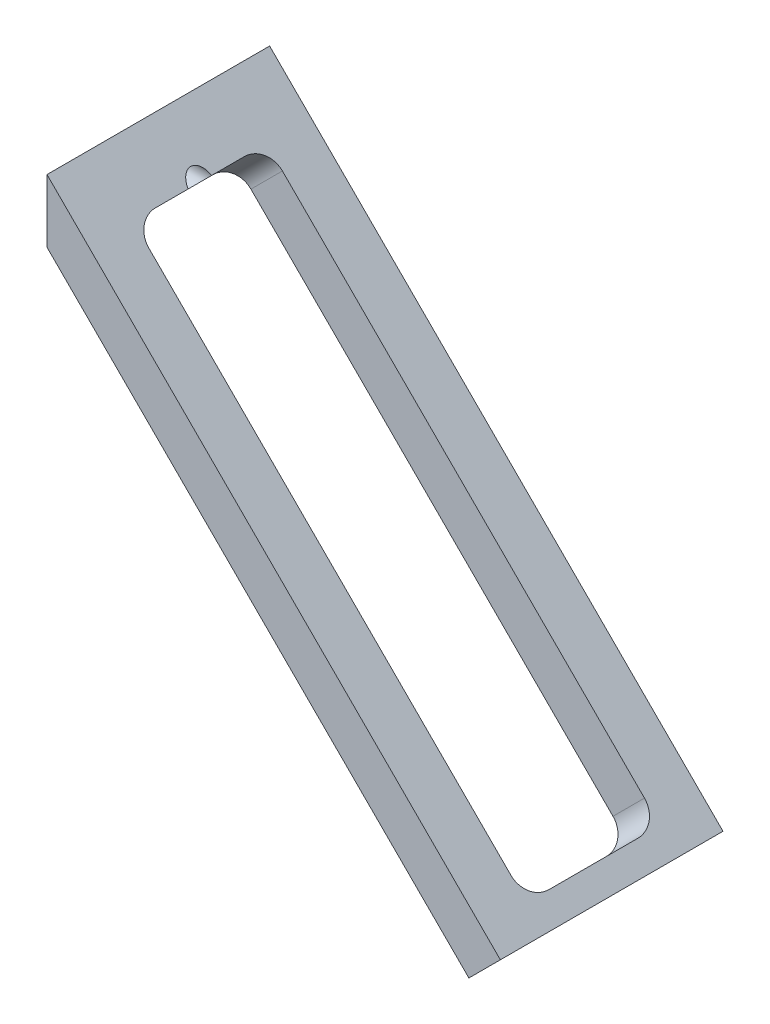
ISO-10303-21;
HEADER;
FILE_DESCRIPTION(('STEP AP214'),'2;1');
FILE_NAME('part.step','',(''),(''),'','','');
FILE_SCHEMA(('AUTOMOTIVE_DESIGN { 1 0 10303 214 1 1 1 1 }'));
ENDSEC;
DATA;
#1=APPLICATION_CONTEXT('core data for automotive mechanical design processes');
#2=APPLICATION_PROTOCOL_DEFINITION('international standard','automotive_design',2000,#1);
#3=PRODUCT_CONTEXT('',#1,'mechanical');
#4=PRODUCT('Part','Part','',(#3));
#5=PRODUCT_RELATED_PRODUCT_CATEGORY('part','',(#4));
#6=PRODUCT_DEFINITION_FORMATION('','',#4);
#7=PRODUCT_DEFINITION_CONTEXT('part definition',#1,'design');
#8=PRODUCT_DEFINITION('design','',#6,#7);
#9=PRODUCT_DEFINITION_SHAPE('','',#8);
#10=(LENGTH_UNIT() NAMED_UNIT(*) SI_UNIT(.MILLI.,.METRE.));
#11=(NAMED_UNIT(*) PLANE_ANGLE_UNIT() SI_UNIT($,.RADIAN.));
#12=(NAMED_UNIT(*) SI_UNIT($,.STERADIAN.) SOLID_ANGLE_UNIT());
#13=UNCERTAINTY_MEASURE_WITH_UNIT(LENGTH_MEASURE(1.E-05),#10,'distance_accuracy_value','');
#14=(GEOMETRIC_REPRESENTATION_CONTEXT(3) GLOBAL_UNCERTAINTY_ASSIGNED_CONTEXT((#13)) GLOBAL_UNIT_ASSIGNED_CONTEXT((#10,
#11,#12)) REPRESENTATION_CONTEXT('',''));
#15=CARTESIAN_POINT('',(0.,0.,0.));
#16=DIRECTION('',(0.,0.,1.));
#17=DIRECTION('',(1.,0.,0.));
#18=AXIS2_PLACEMENT_3D('',#15,#16,#17);
#19=CARTESIAN_POINT('',(-32.328922035849,23.3486659147798,15.875));
#20=DIRECTION('',(0.707106781186546,0.707106781186549,0.));
#21=DIRECTION('',(-0.707106781186549,0.707106781186546,0.));
#22=AXIS2_PLACEMENT_3D('',#19,#20,#21);
#23=PLANE('',#22);
#24=DIRECTION('',(0.707106781186549,-0.707106781186546,0.));
#25=VECTOR('',#24,1.);
#26=CARTESIAN_POINT('',(-32.328922035849,23.3486659147798,-15.875));
#27=LINE('',#26,#25);
#28=CARTESIAN_POINT('',(-32.328922035849,23.3486659147798,-15.875));
#29=VERTEX_POINT('',#28);
#30=CARTESIAN_POINT('',(27.8387939753145,-36.8190500963835,-15.875));
#31=VERTEX_POINT('',#30);
#32=EDGE_CURVE('E188',#29,#31,#27,.T.);
#33=ORIENTED_EDGE('',*,*,#32,.T.);
#34=DIRECTION('',(0.,0.,-1.));
#35=VECTOR('',#34,1.);
#36=CARTESIAN_POINT('',(27.8387939753145,-36.8190500963835,15.875));
#37=LINE('',#36,#35);
#38=CARTESIAN_POINT('',(27.8387939753145,-36.8190500963835,15.875));
#39=VERTEX_POINT('',#38);
#40=EDGE_CURVE('E198',#39,#31,#37,.T.);
#41=ORIENTED_EDGE('',*,*,#40,.F.);
#42=DIRECTION('',(0.707106781186549,-0.707106781186546,0.));
#43=VECTOR('',#42,1.);
#44=CARTESIAN_POINT('',(-32.328922035849,23.3486659147798,15.875));
#45=LINE('',#44,#43);
#46=CARTESIAN_POINT('',(-32.328922035849,23.3486659147798,15.875));
#47=VERTEX_POINT('',#46);
#48=EDGE_CURVE('E177',#47,#39,#45,.T.);
#49=ORIENTED_EDGE('',*,*,#48,.F.);
#50=DIRECTION('',(0.,0.,-1.));
#51=VECTOR('',#50,1.);
#52=CARTESIAN_POINT('',(-32.328922035849,23.3486659147798,15.875));
#53=LINE('',#52,#51);
#54=EDGE_CURVE('E201',#47,#29,#53,.T.);
#55=ORIENTED_EDGE('',*,*,#54,.T.);
#56=EDGE_LOOP('',(#33,#41,#49,#55));
#57=FACE_BOUND('',#56,.T.);
#58=DIRECTION('',(-0.707106781186549,0.707106781186546,0.));
#59=VECTOR('',#58,1.);
#60=CARTESIAN_POINT('',(-32.328922035849,23.3486659147798,9.52500000000001));
#61=LINE('',#60,#59);
#62=CARTESIAN_POINT('',(22.9894556699371,-31.9697117910061,9.52500000000001));
#63=VERTEX_POINT('',#62);
#64=CARTESIAN_POINT('',(-28.6470170262106,19.6667609051414,9.52500000000001));
#65=VERTEX_POINT('',#64);
#66=EDGE_CURVE('E170',#63,#65,#61,.T.);
#67=ORIENTED_EDGE('',*,*,#66,.F.);
#68=CARTESIAN_POINT('',(22.9894556699371,-31.9697117910061,6.35000000000001));
#69=DIRECTION('',(0.707106781186546,0.707106781186549,0.));
#70=DIRECTION('',(-0.707106781186549,0.707106781186546,0.));
#71=AXIS2_PLACEMENT_3D('',#68,#69,#70);
#72=CIRCLE('',#71,3.175);
#73=CARTESIAN_POINT('',(25.2345197002044,-34.2147758212734,6.35000000000001));
#74=VERTEX_POINT('',#73);
#75=EDGE_CURVE('E224',#63,#74,#72,.T.);
#76=ORIENTED_EDGE('',*,*,#75,.T.);
#77=DIRECTION('',(0.,0.,-1.));
#78=VECTOR('',#77,1.);
#79=CARTESIAN_POINT('',(25.2345197002044,-34.2147758212734,15.875));
#80=LINE('',#79,#78);
#81=CARTESIAN_POINT('',(25.2345197002044,-34.2147758212734,-6.34999999999999));
#82=VERTEX_POINT('',#81);
#83=EDGE_CURVE('E162',#74,#82,#80,.T.);
#84=ORIENTED_EDGE('',*,*,#83,.T.);
#85=CARTESIAN_POINT('',(22.9894556699371,-31.9697117910061,-6.34999999999999));
#86=DIRECTION('',(0.707106781186546,0.707106781186549,0.));
#87=DIRECTION('',(-0.707106781186549,0.707106781186546,0.));
#88=AXIS2_PLACEMENT_3D('',#85,#86,#87);
#89=CIRCLE('',#88,3.175);
#90=CARTESIAN_POINT('',(22.9894556699371,-31.9697117910061,-9.52499999999999));
#91=VERTEX_POINT('',#90);
#92=EDGE_CURVE('E228',#82,#91,#89,.T.);
#93=ORIENTED_EDGE('',*,*,#92,.T.);
#94=DIRECTION('',(-0.707106781186549,0.707106781186546,0.));
#95=VECTOR('',#94,1.);
#96=CARTESIAN_POINT('',(-32.328922035849,23.3486659147798,-9.52499999999999));
#97=LINE('',#96,#95);
#98=CARTESIAN_POINT('',(-28.6470170262106,19.6667609051414,-9.52499999999999));
#99=VERTEX_POINT('',#98);
#100=EDGE_CURVE('E165',#91,#99,#97,.T.);
#101=ORIENTED_EDGE('',*,*,#100,.T.);
#102=CARTESIAN_POINT('',(-28.6470170262106,19.6667609051414,-6.34999999999999));
#103=DIRECTION('',(0.707106781186546,0.707106781186549,0.));
#104=DIRECTION('',(-0.707106781186549,0.707106781186546,0.));
#105=AXIS2_PLACEMENT_3D('',#102,#103,#104);
#106=CIRCLE('',#105,3.175);
#107=CARTESIAN_POINT('',(-30.8920810564779,21.9118249354087,-6.34999999999999));
#108=VERTEX_POINT('',#107);
#109=EDGE_CURVE('E232',#99,#108,#106,.T.);
#110=ORIENTED_EDGE('',*,*,#109,.T.);
#111=DIRECTION('',(0.,0.,-1.));
#112=VECTOR('',#111,1.);
#113=CARTESIAN_POINT('',(-30.8920810564779,21.9118249354087,15.875));
#114=LINE('',#113,#112);
#115=CARTESIAN_POINT('',(-30.8920810564779,21.9118249354087,6.35000000000001));
#116=VERTEX_POINT('',#115);
#117=EDGE_CURVE('E168',#116,#108,#114,.T.);
#118=ORIENTED_EDGE('',*,*,#117,.F.);
#119=CARTESIAN_POINT('',(-28.6470170262106,19.6667609051414,6.35000000000001));
#120=DIRECTION('',(0.707106781186546,0.707106781186549,0.));
#121=DIRECTION('',(-0.707106781186549,0.707106781186546,0.));
#122=AXIS2_PLACEMENT_3D('',#119,#120,#121);
#123=CIRCLE('',#122,3.175);
#124=EDGE_CURVE('E50',#116,#65,#123,.T.);
#125=ORIENTED_EDGE('',*,*,#124,.T.);
#126=EDGE_LOOP('',(#67,#76,#84,#93,#101,#110,#118,#125));
#127=FACE_BOUND('',#126,.T.);
#128=ADVANCED_FACE('F42',(#57,#127),#23,.F.);
#129=CARTESIAN_POINT('',(-32.328922035849,32.3289220358489,15.875));
#130=DIRECTION('',(0.707106781186546,0.707106781186549,0.));
#131=DIRECTION('',(-0.707106781186549,0.707106781186546,0.));
#132=AXIS2_PLACEMENT_3D('',#129,#130,#131);
#133=PLANE('',#132);
#134=CARTESIAN_POINT('',(-25.978922035849,25.9789220358489,0.));
#135=DIRECTION('',(0.707106781186546,0.707106781186549,0.));
#136=DIRECTION('',(-0.707106781186549,0.707106781186546,0.));
#137=AXIS2_PLACEMENT_3D('',#134,#135,#136);
#138=ELLIPSE('',#137,2.4426296649308,1.72719999999999);
#139=CARTESIAN_POINT('',(-26.4019529959434,26.4019529959433,-1.67459387518334));
#140=VERTEX_POINT('',#139);
#141=CARTESIAN_POINT('',(-26.4019529959434,26.4019529959433,1.67459387518337));
#142=VERTEX_POINT('',#141);
#143=EDGE_CURVE('E55',#140,#142,#138,.T.);
#144=ORIENTED_EDGE('',*,*,#143,.F.);
#145=DIRECTION('',(0.,0.,-1.));
#146=VECTOR('',#145,1.);
#147=CARTESIAN_POINT('',(-26.4019529959434,26.4019529959433,9.52500000000001));
#148=LINE('',#147,#146);
#149=CARTESIAN_POINT('',(-26.4019529959434,26.4019529959433,-6.34999999999998));
#150=VERTEX_POINT('',#149);
#151=EDGE_CURVE('E62',#140,#150,#148,.T.);
#152=ORIENTED_EDGE('',*,*,#151,.T.);
#153=CARTESIAN_POINT('',(-24.1568889656761,24.156888965676,-6.34999999999999));
#154=DIRECTION('',(0.707106781186546,0.707106781186549,0.));
#155=DIRECTION('',(-0.707106781186549,0.707106781186546,0.));
#156=AXIS2_PLACEMENT_3D('',#153,#154,#155);
#157=CIRCLE('',#156,3.175);
#158=CARTESIAN_POINT('',(-24.1568889656761,24.156888965676,-9.52499999999999));
#159=VERTEX_POINT('',#158);
#160=EDGE_CURVE('E230',#150,#159,#157,.F.);
#161=ORIENTED_EDGE('',*,*,#160,.T.);
#162=DIRECTION('',(-0.707106781186549,0.707106781186546,0.));
#163=VECTOR('',#162,1.);
#164=CARTESIAN_POINT('',(29.724647760739,-29.7246477607388,-9.52499999999999));
#165=LINE('',#164,#163);
#166=CARTESIAN_POINT('',(27.4795837304717,-27.4795837304716,-9.52499999999999));
#167=VERTEX_POINT('',#166);
#168=EDGE_CURVE('E151',#167,#159,#165,.T.);
#169=ORIENTED_EDGE('',*,*,#168,.F.);
#170=CARTESIAN_POINT('',(27.4795837304717,-27.4795837304715,-6.34999999999999));
#171=DIRECTION('',(0.707106781186546,0.707106781186549,0.));
#172=DIRECTION('',(-0.707106781186549,0.707106781186546,0.));
#173=AXIS2_PLACEMENT_3D('',#170,#171,#172);
#174=CIRCLE('',#173,3.175);
#175=CARTESIAN_POINT('',(29.724647760739,-29.7246477607388,-6.34999999999998));
#176=VERTEX_POINT('',#175);
#177=EDGE_CURVE('E226',#167,#176,#174,.F.);
#178=ORIENTED_EDGE('',*,*,#177,.T.);
#179=DIRECTION('',(0.,0.,-1.));
#180=VECTOR('',#179,1.);
#181=CARTESIAN_POINT('',(29.724647760739,-29.7246477607388,9.52500000000001));
#182=LINE('',#181,#180);
#183=CARTESIAN_POINT('',(29.724647760739,-29.7246477607388,6.35000000000001));
#184=VERTEX_POINT('',#183);
#185=EDGE_CURVE('E159',#184,#176,#182,.T.);
#186=ORIENTED_EDGE('',*,*,#185,.F.);
#187=CARTESIAN_POINT('',(27.4795837304717,-27.4795837304715,6.35000000000001));
#188=DIRECTION('',(0.707106781186546,0.707106781186549,0.));
#189=DIRECTION('',(-0.707106781186549,0.707106781186546,0.));
#190=AXIS2_PLACEMENT_3D('',#187,#188,#189);
#191=CIRCLE('',#190,3.175);
#192=CARTESIAN_POINT('',(27.4795837304717,-27.4795837304716,9.52500000000001));
#193=VERTEX_POINT('',#192);
#194=EDGE_CURVE('E222',#184,#193,#191,.F.);
#195=ORIENTED_EDGE('',*,*,#194,.T.);
#196=DIRECTION('',(-0.707106781186549,0.707106781186546,0.));
#197=VECTOR('',#196,1.);
#198=CARTESIAN_POINT('',(29.724647760739,-29.7246477607388,9.52500000000001));
#199=LINE('',#198,#197);
#200=CARTESIAN_POINT('',(-24.1568889656761,24.156888965676,9.52500000000001));
#201=VERTEX_POINT('',#200);
#202=EDGE_CURVE('E149',#193,#201,#199,.T.);
#203=ORIENTED_EDGE('',*,*,#202,.T.);
#204=CARTESIAN_POINT('',(-24.1568889656761,24.156888965676,6.35000000000001));
#205=DIRECTION('',(0.707106781186546,0.707106781186549,0.));
#206=DIRECTION('',(-0.707106781186549,0.707106781186546,0.));
#207=AXIS2_PLACEMENT_3D('',#204,#205,#206);
#208=CIRCLE('',#207,3.175);
#209=CARTESIAN_POINT('',(-26.4019529959434,26.4019529959433,6.35000000000001));
#210=VERTEX_POINT('',#209);
#211=EDGE_CURVE('E234',#201,#210,#208,.F.);
#212=ORIENTED_EDGE('',*,*,#211,.T.);
#213=EDGE_CURVE('E140',#210,#142,#148,.T.);
#214=ORIENTED_EDGE('',*,*,#213,.T.);
#215=EDGE_LOOP('',(#144,#152,#161,#169,#178,#186,#195,#203,#212,#214));
#216=FACE_BOUND('',#215,.T.);
#217=DIRECTION('',(0.707106781186549,-0.707106781186546,0.));
#218=VECTOR('',#217,1.);
#219=CARTESIAN_POINT('',(-32.328922035849,32.3289220358489,-15.875));
#220=LINE('',#219,#218);
#221=CARTESIAN_POINT('',(-32.328922035849,32.3289220358489,-15.875));
#222=VERTEX_POINT('',#221);
#223=CARTESIAN_POINT('',(32.328922035849,-32.3289220358489,-15.875));
#224=VERTEX_POINT('',#223);
#225=EDGE_CURVE('E178',#222,#224,#220,.T.);
#226=ORIENTED_EDGE('',*,*,#225,.F.);
#227=DIRECTION('',(0.,0.,-1.));
#228=VECTOR('',#227,1.);
#229=CARTESIAN_POINT('',(-32.328922035849,32.3289220358489,15.875));
#230=LINE('',#229,#228);
#231=CARTESIAN_POINT('',(-32.328922035849,32.3289220358489,15.875));
#232=VERTEX_POINT('',#231);
#233=EDGE_CURVE('E185',#232,#222,#230,.T.);
#234=ORIENTED_EDGE('',*,*,#233,.F.);
#235=DIRECTION('',(0.707106781186549,-0.707106781186546,0.));
#236=VECTOR('',#235,1.);
#237=CARTESIAN_POINT('',(-32.328922035849,32.3289220358489,15.875));
#238=LINE('',#237,#236);
#239=CARTESIAN_POINT('',(32.328922035849,-32.3289220358489,15.875));
#240=VERTEX_POINT('',#239);
#241=EDGE_CURVE('E182',#232,#240,#238,.T.);
#242=ORIENTED_EDGE('',*,*,#241,.T.);
#243=DIRECTION('',(0.,0.,-1.));
#244=VECTOR('',#243,1.);
#245=CARTESIAN_POINT('',(32.328922035849,-32.3289220358489,15.875));
#246=LINE('',#245,#244);
#247=EDGE_CURVE('E196',#240,#224,#246,.T.);
#248=ORIENTED_EDGE('',*,*,#247,.T.);
#249=EDGE_LOOP('',(#226,#234,#242,#248));
#250=FACE_BOUND('',#249,.T.);
#251=ADVANCED_FACE('F138',(#216,#250),#133,.T.);
#252=CARTESIAN_POINT('',(-32.328922035849,32.3289220358489,15.875));
#253=DIRECTION('',(1.,0.,0.));
#254=DIRECTION('',(0.,0.,-1.));
#255=AXIS2_PLACEMENT_3D('',#252,#253,#254);
#256=PLANE('',#255);
#257=CARTESIAN_POINT('',(-32.328922035849,25.9789220358489,0.));
#258=DIRECTION('',(-1.,0.,0.));
#259=DIRECTION('',(0.,0.,1.));
#260=AXIS2_PLACEMENT_3D('',#257,#258,#259);
#261=CIRCLE('',#260,1.72719999999999);
#262=CARTESIAN_POINT('',(-32.328922035849,25.9789220358489,1.7272));
#263=VERTEX_POINT('',#262);
#264=EDGE_CURVE('E142',#263,#263,#261,.T.);
#265=ORIENTED_EDGE('',*,*,#264,.F.);
#266=EDGE_LOOP('',(#265));
#267=FACE_BOUND('',#266,.T.);
#268=DIRECTION('',(0.,-1.,0.));
#269=VECTOR('',#268,1.);
#270=CARTESIAN_POINT('',(-32.328922035849,32.3289220358489,-15.875));
#271=LINE('',#270,#269);
#272=EDGE_CURVE('E173',#222,#29,#271,.T.);
#273=ORIENTED_EDGE('',*,*,#272,.T.);
#274=ORIENTED_EDGE('',*,*,#54,.F.);
#275=DIRECTION('',(0.,-1.,0.));
#276=VECTOR('',#275,1.);
#277=CARTESIAN_POINT('',(-32.328922035849,32.3289220358489,15.875));
#278=LINE('',#277,#276);
#279=EDGE_CURVE('E174',#232,#47,#278,.T.);
#280=ORIENTED_EDGE('',*,*,#279,.F.);
#281=ORIENTED_EDGE('',*,*,#233,.T.);
#282=EDGE_LOOP('',(#273,#274,#280,#281));
#283=FACE_BOUND('',#282,.T.);
#284=ADVANCED_FACE('F286',(#267,#283),#256,.F.);
#285=CARTESIAN_POINT('',(27.8387939753145,-36.8190500963835,15.875));
#286=DIRECTION('',(-0.707106781186549,0.707106781186546,0.));
#287=DIRECTION('',(-0.707106781186546,-0.707106781186549,0.));
#288=AXIS2_PLACEMENT_3D('',#285,#286,#287);
#289=PLANE('',#288);
#290=CARTESIAN_POINT('',(30.0838580055817,-34.5739860661162,0.));
#291=DIRECTION('',(-0.707106781186549,0.707106781186546,0.));
#292=DIRECTION('',(-0.707106781186546,-0.707106781186549,0.));
#293=AXIS2_PLACEMENT_3D('',#290,#291,#292);
#294=CIRCLE('',#293,2.2479);
#295=CARTESIAN_POINT('',(28.4943526721525,-36.1634913995454,0.));
#296=VERTEX_POINT('',#295);
#297=EDGE_CURVE('E153',#296,#296,#294,.T.);
#298=ORIENTED_EDGE('',*,*,#297,.T.);
#299=EDGE_LOOP('',(#298));
#300=FACE_BOUND('',#299,.T.);
#301=DIRECTION('',(0.707106781186546,0.707106781186549,0.));
#302=VECTOR('',#301,1.);
#303=CARTESIAN_POINT('',(27.8387939753145,-36.8190500963835,-15.875));
#304=LINE('',#303,#302);
#305=EDGE_CURVE('E190',#31,#224,#304,.T.);
#306=ORIENTED_EDGE('',*,*,#305,.T.);
#307=ORIENTED_EDGE('',*,*,#247,.F.);
#308=DIRECTION('',(0.707106781186546,0.707106781186549,0.));
#309=VECTOR('',#308,1.);
#310=CARTESIAN_POINT('',(27.8387939753145,-36.8190500963835,15.875));
#311=LINE('',#310,#309);
#312=EDGE_CURVE('E180',#39,#240,#311,.T.);
#313=ORIENTED_EDGE('',*,*,#312,.F.);
#314=ORIENTED_EDGE('',*,*,#40,.T.);
#315=EDGE_LOOP('',(#306,#307,#313,#314));
#316=FACE_BOUND('',#315,.T.);
#317=ADVANCED_FACE('F289',(#300,#316),#289,.F.);
#318=CARTESIAN_POINT('',(0.,0.,15.875));
#319=DIRECTION('',(0.,0.,1.));
#320=DIRECTION('',(1.,0.,0.));
#321=AXIS2_PLACEMENT_3D('',#318,#319,#320);
#322=PLANE('',#321);
#323=ORIENTED_EDGE('',*,*,#279,.T.);
#324=ORIENTED_EDGE('',*,*,#48,.T.);
#325=ORIENTED_EDGE('',*,*,#312,.T.);
#326=ORIENTED_EDGE('',*,*,#241,.F.);
#327=EDGE_LOOP('',(#323,#324,#325,#326));
#328=FACE_BOUND('',#327,.T.);
#329=ADVANCED_FACE('F297',(#328),#322,.T.);
#330=CARTESIAN_POINT('',(0.,0.,-15.875));
#331=DIRECTION('',(0.,0.,1.));
#332=DIRECTION('',(1.,0.,0.));
#333=AXIS2_PLACEMENT_3D('',#330,#331,#332);
#334=PLANE('',#333);
#335=ORIENTED_EDGE('',*,*,#272,.F.);
#336=ORIENTED_EDGE('',*,*,#225,.T.);
#337=ORIENTED_EDGE('',*,*,#305,.F.);
#338=ORIENTED_EDGE('',*,*,#32,.F.);
#339=EDGE_LOOP('',(#335,#336,#337,#338));
#340=FACE_BOUND('',#339,.T.);
#341=ADVANCED_FACE('F307',(#340),#334,.F.);
#342=CARTESIAN_POINT('',(20.7443916396698,-38.704903881808,9.52500000000001));
#343=DIRECTION('',(0.,0.,-1.));
#344=DIRECTION('',(-1.,0.,0.));
#345=AXIS2_PLACEMENT_3D('',#342,#343,#344);
#346=PLANE('',#345);
#347=ORIENTED_EDGE('',*,*,#202,.F.);
#348=DIRECTION('',(0.707106781186546,0.707106781186549,0.));
#349=VECTOR('',#348,1.);
#350=CARTESIAN_POINT('',(18.4993276094025,-36.4598398515407,9.52500000000001));
#351=LINE('',#350,#349);
#352=EDGE_CURVE('E212',#193,#63,#351,.F.);
#353=ORIENTED_EDGE('',*,*,#352,.T.);
#354=ORIENTED_EDGE('',*,*,#66,.T.);
#355=DIRECTION('',(0.707106781186546,0.707106781186549,0.));
#356=VECTOR('',#355,1.);
#357=CARTESIAN_POINT('',(-24.1568889656761,24.156888965676,9.52500000000001));
#358=LINE('',#357,#356);
#359=EDGE_CURVE('E209',#65,#201,#358,.T.);
#360=ORIENTED_EDGE('',*,*,#359,.T.);
#361=EDGE_LOOP('',(#347,#353,#354,#360));
#362=FACE_BOUND('',#361,.T.);
#363=ADVANCED_FACE('F245',(#362),#346,.T.);
#364=CARTESIAN_POINT('',(-35.3822091170125,17.4216968748741,9.52500000000001));
#365=DIRECTION('',(0.707106781186549,-0.707106781186546,0.));
#366=DIRECTION('',(0.707106781186546,0.707106781186549,0.));
#367=AXIS2_PLACEMENT_3D('',#364,#365,#366);
#368=PLANE('',#367);
#369=CARTESIAN_POINT('',(-26.8249839560377,25.9789220358489,0.));
#370=DIRECTION('',(0.707106781186549,-0.707106781186546,0.));
#371=DIRECTION('',(-0.707106781186546,-0.707106781186549,0.));
#372=AXIS2_PLACEMENT_3D('',#369,#370,#371);
#373=ELLIPSE('',#372,2.4426296649308,1.72719999999999);
#374=EDGE_CURVE('E11',#142,#140,#373,.T.);
#375=ORIENTED_EDGE('',*,*,#374,.F.);
#376=ORIENTED_EDGE('',*,*,#213,.F.);
#377=DIRECTION('',(0.707106781186546,0.707106781186549,0.));
#378=VECTOR('',#377,1.);
#379=CARTESIAN_POINT('',(-30.8920810564779,21.9118249354087,6.35000000000001));
#380=LINE('',#379,#378);
#381=EDGE_CURVE('E219',#210,#116,#380,.F.);
#382=ORIENTED_EDGE('',*,*,#381,.T.);
#383=ORIENTED_EDGE('',*,*,#117,.T.);
#384=DIRECTION('',(0.707106781186546,0.707106781186549,0.));
#385=VECTOR('',#384,1.);
#386=CARTESIAN_POINT('',(-35.3822091170125,17.4216968748741,-6.34999999999999));
#387=LINE('',#386,#385);
#388=EDGE_CURVE('E148',#108,#150,#387,.T.);
#389=ORIENTED_EDGE('',*,*,#388,.T.);
#390=ORIENTED_EDGE('',*,*,#151,.F.);
#391=EDGE_LOOP('',(#375,#376,#382,#383,#389,#390));
#392=FACE_BOUND('',#391,.T.);
#393=ADVANCED_FACE('F145',(#392),#368,.T.);
#394=CARTESIAN_POINT('',(20.7443916396698,-38.704903881808,-9.52499999999999));
#395=DIRECTION('',(0.,0.,-1.));
#396=DIRECTION('',(-1.,0.,0.));
#397=AXIS2_PLACEMENT_3D('',#394,#395,#396);
#398=PLANE('',#397);
#399=ORIENTED_EDGE('',*,*,#100,.F.);
#400=DIRECTION('',(0.707106781186546,0.707106781186549,0.));
#401=VECTOR('',#400,1.);
#402=CARTESIAN_POINT('',(27.4795837304717,-27.4795837304716,-9.52499999999999));
#403=LINE('',#402,#401);
#404=EDGE_CURVE('E216',#91,#167,#403,.T.);
#405=ORIENTED_EDGE('',*,*,#404,.T.);
#406=ORIENTED_EDGE('',*,*,#168,.T.);
#407=DIRECTION('',(0.707106781186546,0.707106781186549,0.));
#408=VECTOR('',#407,1.);
#409=CARTESIAN_POINT('',(-33.1371450867452,15.1766328446068,-9.52499999999999));
#410=LINE('',#409,#408);
#411=EDGE_CURVE('E214',#159,#99,#410,.F.);
#412=ORIENTED_EDGE('',*,*,#411,.T.);
#413=EDGE_LOOP('',(#399,#405,#406,#412));
#414=FACE_BOUND('',#413,.T.);
#415=ADVANCED_FACE('F254',(#414),#398,.F.);
#416=CARTESIAN_POINT('',(20.7443916396698,-38.704903881808,9.52500000000001));
#417=DIRECTION('',(0.707106781186549,-0.707106781186546,0.));
#418=DIRECTION('',(0.707106781186546,0.707106781186549,0.));
#419=AXIS2_PLACEMENT_3D('',#416,#417,#418);
#420=PLANE('',#419);
#421=CARTESIAN_POINT('',(27.4795837304717,-31.9697117910061,0.));
#422=DIRECTION('',(-0.707106781186549,0.707106781186546,0.));
#423=DIRECTION('',(-0.707106781186546,-0.707106781186549,0.));
#424=AXIS2_PLACEMENT_3D('',#421,#422,#423);
#425=CIRCLE('',#424,2.2479);
#426=CARTESIAN_POINT('',(25.8900783970424,-33.5592171244354,0.));
#427=VERTEX_POINT('',#426);
#428=EDGE_CURVE('E141',#427,#427,#425,.T.);
#429=ORIENTED_EDGE('',*,*,#428,.F.);
#430=EDGE_LOOP('',(#429));
#431=FACE_BOUND('',#430,.T.);
#432=ORIENTED_EDGE('',*,*,#83,.F.);
#433=DIRECTION('',(0.707106781186546,0.707106781186549,0.));
#434=VECTOR('',#433,1.);
#435=CARTESIAN_POINT('',(20.7443916396698,-38.704903881808,6.35000000000001));
#436=LINE('',#435,#434);
#437=EDGE_CURVE('E206',#74,#184,#436,.T.);
#438=ORIENTED_EDGE('',*,*,#437,.T.);
#439=ORIENTED_EDGE('',*,*,#185,.T.);
#440=DIRECTION('',(0.707106781186546,0.707106781186549,0.));
#441=VECTOR('',#440,1.);
#442=CARTESIAN_POINT('',(25.2345197002044,-34.2147758212734,-6.34999999999999));
#443=LINE('',#442,#441);
#444=EDGE_CURVE('E204',#176,#82,#443,.F.);
#445=ORIENTED_EDGE('',*,*,#444,.T.);
#446=EDGE_LOOP('',(#432,#438,#439,#445));
#447=FACE_BOUND('',#446,.T.);
#448=ADVANCED_FACE('F263',(#431,#447),#420,.F.);
#449=CARTESIAN_POINT('',(18.4993276094025,-36.4598398515407,6.35000000000001));
#450=DIRECTION('',(0.707106781186546,0.707106781186549,0.));
#451=DIRECTION('',(-0.707106781186549,0.707106781186546,0.));
#452=AXIS2_PLACEMENT_3D('',#449,#450,#451);
#453=CYLINDRICAL_SURFACE('',#452,3.175);
#454=ORIENTED_EDGE('',*,*,#75,.F.);
#455=ORIENTED_EDGE('',*,*,#352,.F.);
#456=ORIENTED_EDGE('',*,*,#194,.F.);
#457=ORIENTED_EDGE('',*,*,#437,.F.);
#458=EDGE_LOOP('',(#454,#455,#456,#457));
#459=FACE_BOUND('',#458,.T.);
#460=ADVANCED_FACE('F266',(#459),#453,.F.);
#461=CARTESIAN_POINT('',(18.4993276094025,-36.4598398515407,-6.34999999999999));
#462=DIRECTION('',(-0.707106781186546,-0.707106781186549,0.));
#463=DIRECTION('',(0.707106781186549,-0.707106781186546,0.));
#464=AXIS2_PLACEMENT_3D('',#461,#462,#463);
#465=CYLINDRICAL_SURFACE('',#464,3.175);
#466=ORIENTED_EDGE('',*,*,#92,.F.);
#467=ORIENTED_EDGE('',*,*,#444,.F.);
#468=ORIENTED_EDGE('',*,*,#177,.F.);
#469=ORIENTED_EDGE('',*,*,#404,.F.);
#470=EDGE_LOOP('',(#466,#467,#468,#469));
#471=FACE_BOUND('',#470,.T.);
#472=ADVANCED_FACE('F258',(#471),#465,.F.);
#473=CARTESIAN_POINT('',(-33.1371450867452,15.1766328446068,-6.34999999999999));
#474=DIRECTION('',(0.707106781186546,0.707106781186549,0.));
#475=DIRECTION('',(-0.707106781186549,0.707106781186546,0.));
#476=AXIS2_PLACEMENT_3D('',#473,#474,#475);
#477=CYLINDRICAL_SURFACE('',#476,3.175);
#478=ORIENTED_EDGE('',*,*,#109,.F.);
#479=ORIENTED_EDGE('',*,*,#411,.F.);
#480=ORIENTED_EDGE('',*,*,#160,.F.);
#481=ORIENTED_EDGE('',*,*,#388,.F.);
#482=EDGE_LOOP('',(#478,#479,#480,#481));
#483=FACE_BOUND('',#482,.T.);
#484=ADVANCED_FACE('F249',(#483),#477,.F.);
#485=CARTESIAN_POINT('',(-33.1371450867452,15.1766328446068,6.35000000000001));
#486=DIRECTION('',(-0.707106781186546,-0.707106781186549,0.));
#487=DIRECTION('',(0.707106781186549,-0.707106781186546,0.));
#488=AXIS2_PLACEMENT_3D('',#485,#486,#487);
#489=CYLINDRICAL_SURFACE('',#488,3.175);
#490=ORIENTED_EDGE('',*,*,#124,.F.);
#491=ORIENTED_EDGE('',*,*,#381,.F.);
#492=ORIENTED_EDGE('',*,*,#211,.F.);
#493=ORIENTED_EDGE('',*,*,#359,.F.);
#494=EDGE_LOOP('',(#490,#491,#492,#493));
#495=FACE_BOUND('',#494,.T.);
#496=ADVANCED_FACE('F44',(#495),#489,.F.);
#497=CARTESIAN_POINT('',(27.4795837304717,-31.9697117910061,0.));
#498=DIRECTION('',(-0.707106781186549,0.707106781186546,0.));
#499=DIRECTION('',(-0.707106781186546,-0.707106781186549,0.));
#500=AXIS2_PLACEMENT_3D('',#497,#498,#499);
#501=CYLINDRICAL_SURFACE('',#500,2.2479);
#502=ORIENTED_EDGE('',*,*,#428,.T.);
#503=EDGE_LOOP('',(#502));
#504=FACE_BOUND('',#503,.T.);
#505=ORIENTED_EDGE('',*,*,#297,.F.);
#506=EDGE_LOOP('',(#505));
#507=FACE_BOUND('',#506,.T.);
#508=ADVANCED_FACE('F329',(#504,#507),#501,.F.);
#509=CARTESIAN_POINT('',(-32.328922035849,25.9789220358489,0.));
#510=DIRECTION('',(-1.,0.,0.));
#511=DIRECTION('',(0.,0.,1.));
#512=AXIS2_PLACEMENT_3D('',#509,#510,#511);
#513=CYLINDRICAL_SURFACE('',#512,1.72719999999999);
#514=ORIENTED_EDGE('',*,*,#143,.T.);
#515=ORIENTED_EDGE('',*,*,#374,.T.);
#516=EDGE_LOOP('',(#514,#515));
#517=FACE_BOUND('',#516,.T.);
#518=ORIENTED_EDGE('',*,*,#264,.T.);
#519=EDGE_LOOP('',(#518));
#520=FACE_BOUND('',#519,.T.);
#521=ADVANCED_FACE('F133',(#517,#520),#513,.F.);
#522=CLOSED_SHELL('',(#128,#251,#284,#317,#329,#341,#363,#393,#415,#448,#460,#472,#484,#496,
#508,#521));
#523=MANIFOLD_SOLID_BREP('B2',#522);
#524=ADVANCED_BREP_SHAPE_REPRESENTATION('',(#18,#523),#14);
#525=SHAPE_DEFINITION_REPRESENTATION(#9,#524);
ENDSEC;
END-ISO-10303-21;
